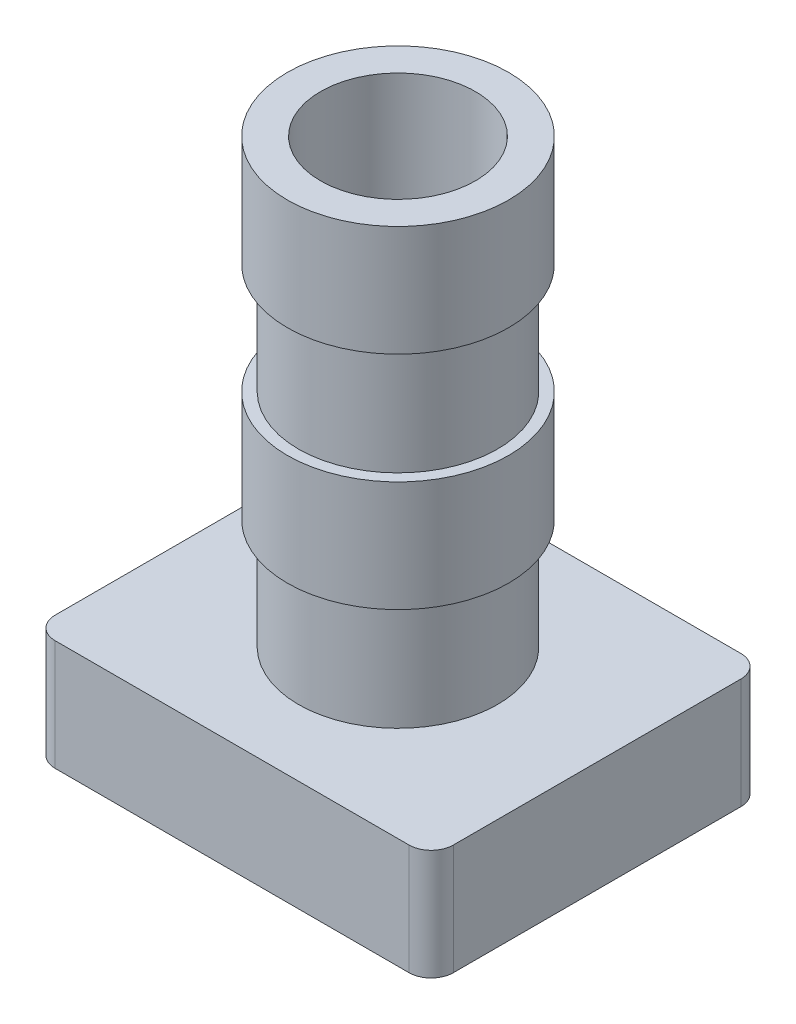
ISO-10303-21;
HEADER;
FILE_DESCRIPTION(('STEP AP214'),'2;1');
FILE_NAME('part.step','',(''),(''),'','','');
FILE_SCHEMA(('AUTOMOTIVE_DESIGN { 1 0 10303 214 1 1 1 1 }'));
ENDSEC;
DATA;
#1=APPLICATION_CONTEXT('core data for automotive mechanical design processes');
#2=APPLICATION_PROTOCOL_DEFINITION('international standard','automotive_design',2000,#1);
#3=PRODUCT_CONTEXT('',#1,'mechanical');
#4=PRODUCT('Part','Part','',(#3));
#5=PRODUCT_RELATED_PRODUCT_CATEGORY('part','',(#4));
#6=PRODUCT_DEFINITION_FORMATION('','',#4);
#7=PRODUCT_DEFINITION_CONTEXT('part definition',#1,'design');
#8=PRODUCT_DEFINITION('design','',#6,#7);
#9=PRODUCT_DEFINITION_SHAPE('','',#8);
#10=(LENGTH_UNIT() NAMED_UNIT(*) SI_UNIT(.MILLI.,.METRE.));
#11=(NAMED_UNIT(*) PLANE_ANGLE_UNIT() SI_UNIT($,.RADIAN.));
#12=(NAMED_UNIT(*) SI_UNIT($,.STERADIAN.) SOLID_ANGLE_UNIT());
#13=UNCERTAINTY_MEASURE_WITH_UNIT(LENGTH_MEASURE(1.E-05),#10,'distance_accuracy_value','');
#14=(GEOMETRIC_REPRESENTATION_CONTEXT(3) GLOBAL_UNCERTAINTY_ASSIGNED_CONTEXT((#13)) GLOBAL_UNIT_ASSIGNED_CONTEXT((#10,
#11,#12)) REPRESENTATION_CONTEXT('',''));
#15=CARTESIAN_POINT('',(0.,0.,0.));
#16=DIRECTION('',(0.,0.,1.));
#17=DIRECTION('',(1.,0.,0.));
#18=AXIS2_PLACEMENT_3D('',#15,#16,#17);
#19=CARTESIAN_POINT('',(0.,5.,7.5));
#20=DIRECTION('',(0.,0.,-1.));
#21=DIRECTION('',(-1.,0.,0.));
#22=AXIS2_PLACEMENT_3D('',#19,#20,#21);
#23=PLANE('',#22);
#24=DIRECTION('',(1.,0.,0.));
#25=VECTOR('',#24,1.);
#26=CARTESIAN_POINT('',(0.,0.,7.5));
#27=LINE('',#26,#25);
#28=CARTESIAN_POINT('',(-8.,0.,7.5));
#29=VERTEX_POINT('',#28);
#30=CARTESIAN_POINT('',(8.,0.,7.5));
#31=VERTEX_POINT('',#30);
#32=EDGE_CURVE('E149',#29,#31,#27,.T.);
#33=ORIENTED_EDGE('',*,*,#32,.T.);
#34=DIRECTION('',(0.,-1.,0.));
#35=VECTOR('',#34,1.);
#36=CARTESIAN_POINT('',(8.,5.,7.5));
#37=LINE('',#36,#35);
#38=CARTESIAN_POINT('',(8.,5.,7.5));
#39=VERTEX_POINT('',#38);
#40=EDGE_CURVE('E54',#39,#31,#37,.T.);
#41=ORIENTED_EDGE('',*,*,#40,.F.);
#42=DIRECTION('',(1.,0.,0.));
#43=VECTOR('',#42,1.);
#44=CARTESIAN_POINT('',(0.,5.,7.5));
#45=LINE('',#44,#43);
#46=CARTESIAN_POINT('',(-8.,5.,7.5));
#47=VERTEX_POINT('',#46);
#48=EDGE_CURVE('E168',#47,#39,#45,.T.);
#49=ORIENTED_EDGE('',*,*,#48,.F.);
#50=DIRECTION('',(0.,-1.,0.));
#51=VECTOR('',#50,1.);
#52=CARTESIAN_POINT('',(-8.,5.,7.5));
#53=LINE('',#52,#51);
#54=EDGE_CURVE('E145',#47,#29,#53,.T.);
#55=ORIENTED_EDGE('',*,*,#54,.T.);
#56=EDGE_LOOP('',(#33,#41,#49,#55));
#57=FACE_BOUND('',#56,.T.);
#58=ADVANCED_FACE('F51',(#57),#23,.F.);
#59=CARTESIAN_POINT('',(8.,5.,6.5));
#60=DIRECTION('',(0.,-1.,0.));
#61=DIRECTION('',(0.,0.,-1.));
#62=AXIS2_PLACEMENT_3D('',#59,#60,#61);
#63=CYLINDRICAL_SURFACE('',#62,1.);
#64=CARTESIAN_POINT('',(8.,0.,6.5));
#65=DIRECTION('',(0.,1.,0.));
#66=DIRECTION('',(0.,0.,1.));
#67=AXIS2_PLACEMENT_3D('',#64,#65,#66);
#68=CIRCLE('',#67,1.);
#69=CARTESIAN_POINT('',(9.,0.,6.5));
#70=VERTEX_POINT('',#69);
#71=EDGE_CURVE('E152',#31,#70,#68,.T.);
#72=ORIENTED_EDGE('',*,*,#71,.T.);
#73=DIRECTION('',(0.,-1.,0.));
#74=VECTOR('',#73,1.);
#75=CARTESIAN_POINT('',(9.,5.,6.5));
#76=LINE('',#75,#74);
#77=CARTESIAN_POINT('',(9.,5.,6.5));
#78=VERTEX_POINT('',#77);
#79=EDGE_CURVE('E175',#78,#70,#76,.T.);
#80=ORIENTED_EDGE('',*,*,#79,.F.);
#81=CARTESIAN_POINT('',(8.,5.,6.5));
#82=DIRECTION('',(0.,1.,0.));
#83=DIRECTION('',(0.,0.,1.));
#84=AXIS2_PLACEMENT_3D('',#81,#82,#83);
#85=CIRCLE('',#84,1.);
#86=EDGE_CURVE('E112',#39,#78,#85,.T.);
#87=ORIENTED_EDGE('',*,*,#86,.F.);
#88=ORIENTED_EDGE('',*,*,#40,.T.);
#89=EDGE_LOOP('',(#72,#80,#87,#88));
#90=FACE_BOUND('',#89,.T.);
#91=ADVANCED_FACE('F180',(#90),#63,.T.);
#92=CARTESIAN_POINT('',(9.,5.,0.));
#93=DIRECTION('',(1.,0.,0.));
#94=DIRECTION('',(0.,0.,-1.));
#95=AXIS2_PLACEMENT_3D('',#92,#93,#94);
#96=PLANE('',#95);
#97=DIRECTION('',(0.,0.,1.));
#98=VECTOR('',#97,1.);
#99=CARTESIAN_POINT('',(9.,0.,0.));
#100=LINE('',#99,#98);
#101=CARTESIAN_POINT('',(9.,0.,-6.5));
#102=VERTEX_POINT('',#101);
#103=EDGE_CURVE('E156',#102,#70,#100,.T.);
#104=ORIENTED_EDGE('',*,*,#103,.F.);
#105=DIRECTION('',(0.,-1.,0.));
#106=VECTOR('',#105,1.);
#107=CARTESIAN_POINT('',(9.,5.,-6.5));
#108=LINE('',#107,#106);
#109=CARTESIAN_POINT('',(9.,5.,-6.5));
#110=VERTEX_POINT('',#109);
#111=EDGE_CURVE('E174',#110,#102,#108,.T.);
#112=ORIENTED_EDGE('',*,*,#111,.F.);
#113=DIRECTION('',(0.,0.,1.));
#114=VECTOR('',#113,1.);
#115=CARTESIAN_POINT('',(9.,5.,0.));
#116=LINE('',#115,#114);
#117=EDGE_CURVE('E190',#110,#78,#116,.T.);
#118=ORIENTED_EDGE('',*,*,#117,.T.);
#119=ORIENTED_EDGE('',*,*,#79,.T.);
#120=EDGE_LOOP('',(#104,#112,#118,#119));
#121=FACE_BOUND('',#120,.T.);
#122=ADVANCED_FACE('F188',(#121),#96,.T.);
#123=CARTESIAN_POINT('',(8.,5.,-6.5));
#124=DIRECTION('',(0.,-1.,0.));
#125=DIRECTION('',(0.,0.,-1.));
#126=AXIS2_PLACEMENT_3D('',#123,#124,#125);
#127=CYLINDRICAL_SURFACE('',#126,0.999999999999998);
#128=CARTESIAN_POINT('',(8.,0.,-6.5));
#129=DIRECTION('',(0.,1.,0.));
#130=DIRECTION('',(0.,0.,1.));
#131=AXIS2_PLACEMENT_3D('',#128,#129,#130);
#132=CIRCLE('',#131,0.999999999999998);
#133=CARTESIAN_POINT('',(8.,0.,-7.5));
#134=VERTEX_POINT('',#133);
#135=EDGE_CURVE('E159',#134,#102,#132,.F.);
#136=ORIENTED_EDGE('',*,*,#135,.F.);
#137=DIRECTION('',(0.,-1.,0.));
#138=VECTOR('',#137,1.);
#139=CARTESIAN_POINT('',(8.,5.,-7.5));
#140=LINE('',#139,#138);
#141=CARTESIAN_POINT('',(8.,5.,-7.5));
#142=VERTEX_POINT('',#141);
#143=EDGE_CURVE('E172',#142,#134,#140,.T.);
#144=ORIENTED_EDGE('',*,*,#143,.F.);
#145=CARTESIAN_POINT('',(8.,5.,-6.5));
#146=DIRECTION('',(0.,1.,0.));
#147=DIRECTION('',(0.,0.,1.));
#148=AXIS2_PLACEMENT_3D('',#145,#146,#147);
#149=CIRCLE('',#148,0.999999999999998);
#150=EDGE_CURVE('E193',#142,#110,#149,.F.);
#151=ORIENTED_EDGE('',*,*,#150,.T.);
#152=ORIENTED_EDGE('',*,*,#111,.T.);
#153=EDGE_LOOP('',(#136,#144,#151,#152));
#154=FACE_BOUND('',#153,.T.);
#155=ADVANCED_FACE('F195',(#154),#127,.T.);
#156=CARTESIAN_POINT('',(0.,5.,-7.5));
#157=DIRECTION('',(0.,0.,-1.));
#158=DIRECTION('',(-1.,0.,0.));
#159=AXIS2_PLACEMENT_3D('',#156,#157,#158);
#160=PLANE('',#159);
#161=DIRECTION('',(1.,0.,0.));
#162=VECTOR('',#161,1.);
#163=CARTESIAN_POINT('',(0.,0.,-7.5));
#164=LINE('',#163,#162);
#165=CARTESIAN_POINT('',(-8.,0.,-7.5));
#166=VERTEX_POINT('',#165);
#167=EDGE_CURVE('E162',#166,#134,#164,.T.);
#168=ORIENTED_EDGE('',*,*,#167,.F.);
#169=DIRECTION('',(0.,-1.,0.));
#170=VECTOR('',#169,1.);
#171=CARTESIAN_POINT('',(-8.,5.,-7.5));
#172=LINE('',#171,#170);
#173=CARTESIAN_POINT('',(-8.,5.,-7.5));
#174=VERTEX_POINT('',#173);
#175=EDGE_CURVE('E140',#174,#166,#172,.T.);
#176=ORIENTED_EDGE('',*,*,#175,.F.);
#177=DIRECTION('',(1.,0.,0.));
#178=VECTOR('',#177,1.);
#179=CARTESIAN_POINT('',(0.,5.,-7.5));
#180=LINE('',#179,#178);
#181=EDGE_CURVE('E133',#174,#142,#180,.T.);
#182=ORIENTED_EDGE('',*,*,#181,.T.);
#183=ORIENTED_EDGE('',*,*,#143,.T.);
#184=EDGE_LOOP('',(#168,#176,#182,#183));
#185=FACE_BOUND('',#184,.T.);
#186=ADVANCED_FACE('F269',(#185),#160,.T.);
#187=CARTESIAN_POINT('',(-8.,5.,-6.5));
#188=DIRECTION('',(0.,-1.,0.));
#189=DIRECTION('',(0.,0.,-1.));
#190=AXIS2_PLACEMENT_3D('',#187,#188,#189);
#191=CYLINDRICAL_SURFACE('',#190,1.);
#192=CARTESIAN_POINT('',(-8.,0.,-6.5));
#193=DIRECTION('',(0.,1.,0.));
#194=DIRECTION('',(0.,0.,1.));
#195=AXIS2_PLACEMENT_3D('',#192,#193,#194);
#196=CIRCLE('',#195,1.);
#197=CARTESIAN_POINT('',(-9.,0.,-6.5));
#198=VERTEX_POINT('',#197);
#199=EDGE_CURVE('E139',#166,#198,#196,.T.);
#200=ORIENTED_EDGE('',*,*,#199,.T.);
#201=DIRECTION('',(0.,-1.,0.));
#202=VECTOR('',#201,1.);
#203=CARTESIAN_POINT('',(-9.,5.,-6.5));
#204=LINE('',#203,#202);
#205=CARTESIAN_POINT('',(-9.,5.,-6.5));
#206=VERTEX_POINT('',#205);
#207=EDGE_CURVE('E136',#206,#198,#204,.T.);
#208=ORIENTED_EDGE('',*,*,#207,.F.);
#209=CARTESIAN_POINT('',(-8.,5.,-6.5));
#210=DIRECTION('',(0.,1.,0.));
#211=DIRECTION('',(0.,0.,1.));
#212=AXIS2_PLACEMENT_3D('',#209,#210,#211);
#213=CIRCLE('',#212,1.);
#214=EDGE_CURVE('E126',#174,#206,#213,.T.);
#215=ORIENTED_EDGE('',*,*,#214,.F.);
#216=ORIENTED_EDGE('',*,*,#175,.T.);
#217=EDGE_LOOP('',(#200,#208,#215,#216));
#218=FACE_BOUND('',#217,.T.);
#219=ADVANCED_FACE('F137',(#218),#191,.T.);
#220=CARTESIAN_POINT('',(-9.,5.,0.));
#221=DIRECTION('',(1.,0.,0.));
#222=DIRECTION('',(0.,0.,-1.));
#223=AXIS2_PLACEMENT_3D('',#220,#221,#222);
#224=PLANE('',#223);
#225=DIRECTION('',(0.,0.,1.));
#226=VECTOR('',#225,1.);
#227=CARTESIAN_POINT('',(-9.,0.,0.));
#228=LINE('',#227,#226);
#229=CARTESIAN_POINT('',(-8.99999999999999,0.,6.5));
#230=VERTEX_POINT('',#229);
#231=EDGE_CURVE('E97',#198,#230,#228,.T.);
#232=ORIENTED_EDGE('',*,*,#231,.T.);
#233=DIRECTION('',(0.,-1.,0.));
#234=VECTOR('',#233,1.);
#235=CARTESIAN_POINT('',(-8.99999999999999,5.,6.5));
#236=LINE('',#235,#234);
#237=CARTESIAN_POINT('',(-8.99999999999999,5.,6.5));
#238=VERTEX_POINT('',#237);
#239=EDGE_CURVE('E141',#238,#230,#236,.T.);
#240=ORIENTED_EDGE('',*,*,#239,.F.);
#241=DIRECTION('',(0.,0.,1.));
#242=VECTOR('',#241,1.);
#243=CARTESIAN_POINT('',(-9.,5.,0.));
#244=LINE('',#243,#242);
#245=EDGE_CURVE('E130',#206,#238,#244,.T.);
#246=ORIENTED_EDGE('',*,*,#245,.F.);
#247=ORIENTED_EDGE('',*,*,#207,.T.);
#248=EDGE_LOOP('',(#232,#240,#246,#247));
#249=FACE_BOUND('',#248,.T.);
#250=ADVANCED_FACE('F143',(#249),#224,.F.);
#251=CARTESIAN_POINT('',(-7.99999999999999,5.,6.5));
#252=DIRECTION('',(0.,-1.,0.));
#253=DIRECTION('',(0.,0.,-1.));
#254=AXIS2_PLACEMENT_3D('',#251,#252,#253);
#255=CYLINDRICAL_SURFACE('',#254,1.);
#256=CARTESIAN_POINT('',(-7.99999999999999,0.,6.5));
#257=DIRECTION('',(0.,1.,0.));
#258=DIRECTION('',(0.,0.,1.));
#259=AXIS2_PLACEMENT_3D('',#256,#257,#258);
#260=CIRCLE('',#259,1.);
#261=EDGE_CURVE('E103',#230,#29,#260,.T.);
#262=ORIENTED_EDGE('',*,*,#261,.T.);
#263=ORIENTED_EDGE('',*,*,#54,.F.);
#264=CARTESIAN_POINT('',(-7.99999999999999,5.,6.5));
#265=DIRECTION('',(0.,1.,0.));
#266=DIRECTION('',(0.,0.,1.));
#267=AXIS2_PLACEMENT_3D('',#264,#265,#266);
#268=CIRCLE('',#267,1.);
#269=EDGE_CURVE('E68',#238,#47,#268,.T.);
#270=ORIENTED_EDGE('',*,*,#269,.F.);
#271=ORIENTED_EDGE('',*,*,#239,.T.);
#272=EDGE_LOOP('',(#262,#263,#270,#271));
#273=FACE_BOUND('',#272,.T.);
#274=ADVANCED_FACE('F277',(#273),#255,.T.);
#275=CARTESIAN_POINT('',(0.,5.,0.));
#276=DIRECTION('',(0.,1.,0.));
#277=DIRECTION('',(0.,0.,1.));
#278=AXIS2_PLACEMENT_3D('',#275,#276,#277);
#279=PLANE('',#278);
#280=CARTESIAN_POINT('',(0.,5.,0.));
#281=DIRECTION('',(0.,1.,0.));
#282=DIRECTION('',(0.,0.,1.));
#283=AXIS2_PLACEMENT_3D('',#280,#281,#282);
#284=CIRCLE('',#283,4.5);
#285=CARTESIAN_POINT('',(0.,5.,4.5));
#286=VERTEX_POINT('',#285);
#287=EDGE_CURVE('E202',#286,#286,#284,.F.);
#288=ORIENTED_EDGE('',*,*,#287,.T.);
#289=EDGE_LOOP('',(#288));
#290=FACE_BOUND('',#289,.T.);
#291=ORIENTED_EDGE('',*,*,#48,.T.);
#292=ORIENTED_EDGE('',*,*,#86,.T.);
#293=ORIENTED_EDGE('',*,*,#117,.F.);
#294=ORIENTED_EDGE('',*,*,#150,.F.);
#295=ORIENTED_EDGE('',*,*,#181,.F.);
#296=ORIENTED_EDGE('',*,*,#214,.T.);
#297=ORIENTED_EDGE('',*,*,#245,.T.);
#298=ORIENTED_EDGE('',*,*,#269,.T.);
#299=EDGE_LOOP('',(#291,#292,#293,#294,#295,#296,#297,#298));
#300=FACE_BOUND('',#299,.T.);
#301=ADVANCED_FACE('F128',(#290,#300),#279,.T.);
#302=CARTESIAN_POINT('',(0.,0.,0.));
#303=DIRECTION('',(0.,1.,0.));
#304=DIRECTION('',(0.,0.,1.));
#305=AXIS2_PLACEMENT_3D('',#302,#303,#304);
#306=PLANE('',#305);
#307=ORIENTED_EDGE('',*,*,#32,.F.);
#308=ORIENTED_EDGE('',*,*,#261,.F.);
#309=ORIENTED_EDGE('',*,*,#231,.F.);
#310=ORIENTED_EDGE('',*,*,#199,.F.);
#311=ORIENTED_EDGE('',*,*,#167,.T.);
#312=ORIENTED_EDGE('',*,*,#135,.T.);
#313=ORIENTED_EDGE('',*,*,#103,.T.);
#314=ORIENTED_EDGE('',*,*,#71,.F.);
#315=EDGE_LOOP('',(#307,#308,#309,#310,#311,#312,#313,#314));
#316=FACE_BOUND('',#315,.T.);
#317=CARTESIAN_POINT('',(0.,0.,0.));
#318=DIRECTION('',(0.,1.,0.));
#319=DIRECTION('',(0.,0.,1.));
#320=AXIS2_PLACEMENT_3D('',#317,#318,#319);
#321=CIRCLE('',#320,4.);
#322=CARTESIAN_POINT('',(0.,0.,4.));
#323=VERTEX_POINT('',#322);
#324=EDGE_CURVE('E153',#323,#323,#321,.T.);
#325=ORIENTED_EDGE('',*,*,#324,.T.);
#326=EDGE_LOOP('',(#325));
#327=FACE_BOUND('',#326,.T.);
#328=ADVANCED_FACE('F185',(#316,#327),#306,.F.);
#329=CARTESIAN_POINT('',(0.,5.,0.));
#330=DIRECTION('',(0.,-1.,0.));
#331=DIRECTION('',(0.,0.,-1.));
#332=AXIS2_PLACEMENT_3D('',#329,#330,#331);
#333=CYLINDRICAL_SURFACE('',#332,4.);
#334=ORIENTED_EDGE('',*,*,#324,.F.);
#335=EDGE_LOOP('',(#334));
#336=FACE_BOUND('',#335,.T.);
#337=CARTESIAN_POINT('',(0.,10.,0.));
#338=DIRECTION('',(0.,1.,0.));
#339=DIRECTION('',(0.,0.,1.));
#340=AXIS2_PLACEMENT_3D('',#337,#338,#339);
#341=CIRCLE('',#340,4.);
#342=CARTESIAN_POINT('',(0.,10.,4.));
#343=VERTEX_POINT('',#342);
#344=EDGE_CURVE('E208',#343,#343,#341,.T.);
#345=ORIENTED_EDGE('',*,*,#344,.T.);
#346=EDGE_LOOP('',(#345));
#347=FACE_BOUND('',#346,.T.);
#348=ADVANCED_FACE('F282',(#336,#347),#333,.F.);
#349=CARTESIAN_POINT('',(0.,10.,0.));
#350=DIRECTION('',(0.,-1.,0.));
#351=DIRECTION('',(0.,0.,-1.));
#352=AXIS2_PLACEMENT_3D('',#349,#350,#351);
#353=CYLINDRICAL_SURFACE('',#352,4.5);
#354=ORIENTED_EDGE('',*,*,#287,.F.);
#355=EDGE_LOOP('',(#354));
#356=FACE_BOUND('',#355,.T.);
#357=CARTESIAN_POINT('',(0.,10.,0.));
#358=DIRECTION('',(0.,1.,0.));
#359=DIRECTION('',(0.,0.,1.));
#360=AXIS2_PLACEMENT_3D('',#357,#358,#359);
#361=CIRCLE('',#360,4.5);
#362=CARTESIAN_POINT('',(0.,10.,4.5));
#363=VERTEX_POINT('',#362);
#364=EDGE_CURVE('E205',#363,#363,#361,.T.);
#365=ORIENTED_EDGE('',*,*,#364,.F.);
#366=EDGE_LOOP('',(#365));
#367=FACE_BOUND('',#366,.T.);
#368=ADVANCED_FACE('F288',(#356,#367),#353,.T.);
#369=CARTESIAN_POINT('',(0.,10.,0.));
#370=DIRECTION('',(0.,1.,0.));
#371=DIRECTION('',(0.,0.,1.));
#372=AXIS2_PLACEMENT_3D('',#369,#370,#371);
#373=PLANE('',#372);
#374=ORIENTED_EDGE('',*,*,#364,.T.);
#375=EDGE_LOOP('',(#374));
#376=FACE_BOUND('',#375,.T.);
#377=CARTESIAN_POINT('',(0.,10.,0.));
#378=DIRECTION('',(0.,1.,0.));
#379=DIRECTION('',(0.,0.,1.));
#380=AXIS2_PLACEMENT_3D('',#377,#378,#379);
#381=CIRCLE('',#380,5.);
#382=CARTESIAN_POINT('',(0.,10.,5.));
#383=VERTEX_POINT('',#382);
#384=EDGE_CURVE('E212',#383,#383,#381,.T.);
#385=ORIENTED_EDGE('',*,*,#384,.F.);
#386=EDGE_LOOP('',(#385));
#387=FACE_BOUND('',#386,.T.);
#388=ADVANCED_FACE('F292',(#376,#387),#373,.F.);
#389=CARTESIAN_POINT('',(0.,15.,0.));
#390=DIRECTION('',(0.,1.,0.));
#391=DIRECTION('',(0.,0.,1.));
#392=AXIS2_PLACEMENT_3D('',#389,#390,#391);
#393=PLANE('',#392);
#394=CARTESIAN_POINT('',(0.,15.,0.));
#395=DIRECTION('',(0.,1.,0.));
#396=DIRECTION('',(0.,0.,1.));
#397=AXIS2_PLACEMENT_3D('',#394,#395,#396);
#398=CIRCLE('',#397,4.5);
#399=CARTESIAN_POINT('',(0.,15.,4.5));
#400=VERTEX_POINT('',#399);
#401=EDGE_CURVE('E12',#400,#400,#398,.T.);
#402=ORIENTED_EDGE('',*,*,#401,.F.);
#403=EDGE_LOOP('',(#402));
#404=FACE_BOUND('',#403,.T.);
#405=CARTESIAN_POINT('',(0.,15.,0.));
#406=DIRECTION('',(0.,1.,0.));
#407=DIRECTION('',(0.,0.,1.));
#408=AXIS2_PLACEMENT_3D('',#405,#406,#407);
#409=CIRCLE('',#408,5.);
#410=CARTESIAN_POINT('',(0.,15.,5.));
#411=VERTEX_POINT('',#410);
#412=EDGE_CURVE('E211',#411,#411,#409,.T.);
#413=ORIENTED_EDGE('',*,*,#412,.T.);
#414=EDGE_LOOP('',(#413));
#415=FACE_BOUND('',#414,.T.);
#416=ADVANCED_FACE('F298',(#404,#415),#393,.T.);
#417=CARTESIAN_POINT('',(0.,15.,0.));
#418=DIRECTION('',(0.,-1.,0.));
#419=DIRECTION('',(0.,0.,-1.));
#420=AXIS2_PLACEMENT_3D('',#417,#418,#419);
#421=CYLINDRICAL_SURFACE('',#420,5.);
#422=ORIENTED_EDGE('',*,*,#412,.F.);
#423=EDGE_LOOP('',(#422));
#424=FACE_BOUND('',#423,.T.);
#425=ORIENTED_EDGE('',*,*,#384,.T.);
#426=EDGE_LOOP('',(#425));
#427=FACE_BOUND('',#426,.T.);
#428=ADVANCED_FACE('F294',(#424,#427),#421,.T.);
#429=ORIENTED_EDGE('',*,*,#344,.F.);
#430=EDGE_LOOP('',(#429));
#431=FACE_BOUND('',#430,.T.);
#432=ADVANCED_FACE('F297',(#431),#373,.F.);
#433=CARTESIAN_POINT('',(0.,20.,0.));
#434=DIRECTION('',(0.,-1.,0.));
#435=DIRECTION('',(0.,0.,-1.));
#436=AXIS2_PLACEMENT_3D('',#433,#434,#435);
#437=CYLINDRICAL_SURFACE('',#436,4.5);
#438=CARTESIAN_POINT('',(0.,20.,0.));
#439=DIRECTION('',(0.,1.,0.));
#440=DIRECTION('',(0.,0.,1.));
#441=AXIS2_PLACEMENT_3D('',#438,#439,#440);
#442=CIRCLE('',#441,4.5);
#443=CARTESIAN_POINT('',(0.,20.,4.5));
#444=VERTEX_POINT('',#443);
#445=EDGE_CURVE('E215',#444,#444,#442,.T.);
#446=ORIENTED_EDGE('',*,*,#445,.F.);
#447=EDGE_LOOP('',(#446));
#448=FACE_BOUND('',#447,.T.);
#449=ORIENTED_EDGE('',*,*,#401,.T.);
#450=EDGE_LOOP('',(#449));
#451=FACE_BOUND('',#450,.T.);
#452=ADVANCED_FACE('F245',(#448,#451),#437,.T.);
#453=CARTESIAN_POINT('',(0.,25.,0.));
#454=DIRECTION('',(0.,-1.,0.));
#455=DIRECTION('',(0.,0.,-1.));
#456=AXIS2_PLACEMENT_3D('',#453,#454,#455);
#457=CYLINDRICAL_SURFACE('',#456,5.);
#458=CARTESIAN_POINT('',(0.,25.,0.));
#459=DIRECTION('',(0.,1.,0.));
#460=DIRECTION('',(0.,0.,1.));
#461=AXIS2_PLACEMENT_3D('',#458,#459,#460);
#462=CIRCLE('',#461,5.);
#463=CARTESIAN_POINT('',(0.,25.,5.));
#464=VERTEX_POINT('',#463);
#465=EDGE_CURVE('E220',#464,#464,#462,.T.);
#466=ORIENTED_EDGE('',*,*,#465,.F.);
#467=EDGE_LOOP('',(#466));
#468=FACE_BOUND('',#467,.T.);
#469=CARTESIAN_POINT('',(0.,20.,0.));
#470=DIRECTION('',(0.,1.,0.));
#471=DIRECTION('',(0.,0.,1.));
#472=AXIS2_PLACEMENT_3D('',#469,#470,#471);
#473=CIRCLE('',#472,5.);
#474=CARTESIAN_POINT('',(0.,20.,5.));
#475=VERTEX_POINT('',#474);
#476=EDGE_CURVE('E221',#475,#475,#473,.T.);
#477=ORIENTED_EDGE('',*,*,#476,.T.);
#478=EDGE_LOOP('',(#477));
#479=FACE_BOUND('',#478,.T.);
#480=ADVANCED_FACE('F239',(#468,#479),#457,.T.);
#481=CARTESIAN_POINT('',(0.,25.,0.));
#482=DIRECTION('',(0.,1.,0.));
#483=DIRECTION('',(0.,0.,1.));
#484=AXIS2_PLACEMENT_3D('',#481,#482,#483);
#485=PLANE('',#484);
#486=CARTESIAN_POINT('',(0.,25.,0.));
#487=DIRECTION('',(0.,1.,0.));
#488=DIRECTION('',(0.,0.,1.));
#489=AXIS2_PLACEMENT_3D('',#486,#487,#488);
#490=CIRCLE('',#489,3.5);
#491=CARTESIAN_POINT('',(0.,25.,3.5));
#492=VERTEX_POINT('',#491);
#493=EDGE_CURVE('E229',#492,#492,#490,.T.);
#494=ORIENTED_EDGE('',*,*,#493,.F.);
#495=EDGE_LOOP('',(#494));
#496=FACE_BOUND('',#495,.T.);
#497=ORIENTED_EDGE('',*,*,#465,.T.);
#498=EDGE_LOOP('',(#497));
#499=FACE_BOUND('',#498,.T.);
#500=ADVANCED_FACE('F235',(#496,#499),#485,.T.);
#501=CARTESIAN_POINT('',(0.,20.,0.));
#502=DIRECTION('',(0.,1.,0.));
#503=DIRECTION('',(0.,0.,1.));
#504=AXIS2_PLACEMENT_3D('',#501,#502,#503);
#505=PLANE('',#504);
#506=ORIENTED_EDGE('',*,*,#445,.T.);
#507=EDGE_LOOP('',(#506));
#508=FACE_BOUND('',#507,.T.);
#509=ORIENTED_EDGE('',*,*,#476,.F.);
#510=EDGE_LOOP('',(#509));
#511=FACE_BOUND('',#510,.T.);
#512=ADVANCED_FACE('F238',(#508,#511),#505,.F.);
#513=CARTESIAN_POINT('',(0.,10.1005050633883,0.));
#514=DIRECTION('',(0.,1.,0.));
#515=DIRECTION('',(0.,0.,1.));
#516=AXIS2_PLACEMENT_3D('',#513,#514,#515);
#517=CYLINDRICAL_SURFACE('',#516,3.5);
#518=CARTESIAN_POINT('',(0.,20.,0.));
#519=DIRECTION('',(0.,1.,0.));
#520=DIRECTION('',(0.,0.,1.));
#521=AXIS2_PLACEMENT_3D('',#518,#519,#520);
#522=CIRCLE('',#521,3.5);
#523=CARTESIAN_POINT('',(0.,20.,3.5));
#524=VERTEX_POINT('',#523);
#525=EDGE_CURVE('E224',#524,#524,#522,.F.);
#526=ORIENTED_EDGE('',*,*,#525,.T.);
#527=EDGE_LOOP('',(#526));
#528=FACE_BOUND('',#527,.T.);
#529=ORIENTED_EDGE('',*,*,#493,.T.);
#530=EDGE_LOOP('',(#529));
#531=FACE_BOUND('',#530,.T.);
#532=ADVANCED_FACE('F233',(#528,#531),#517,.F.);
#533=CARTESIAN_POINT('',(0.,20.,0.));
#534=DIRECTION('',(0.,1.,0.));
#535=DIRECTION('',(0.,0.,1.));
#536=AXIS2_PLACEMENT_3D('',#533,#534,#535);
#537=PLANE('',#536);
#538=ORIENTED_EDGE('',*,*,#525,.F.);
#539=EDGE_LOOP('',(#538));
#540=FACE_BOUND('',#539,.T.);
#541=ADVANCED_FACE('F255',(#540),#537,.T.);
#542=CLOSED_SHELL('',(#58,#91,#122,#155,#186,#219,#250,#274,#301,#328,#348,#368,#388,#416,#428,
#432,#452,#480,#500,#512,#532,#541));
#543=MANIFOLD_SOLID_BREP('B2',#542);
#544=ADVANCED_BREP_SHAPE_REPRESENTATION('',(#18,#543),#14);
#545=SHAPE_DEFINITION_REPRESENTATION(#9,#544);
ENDSEC;
END-ISO-10303-21;
